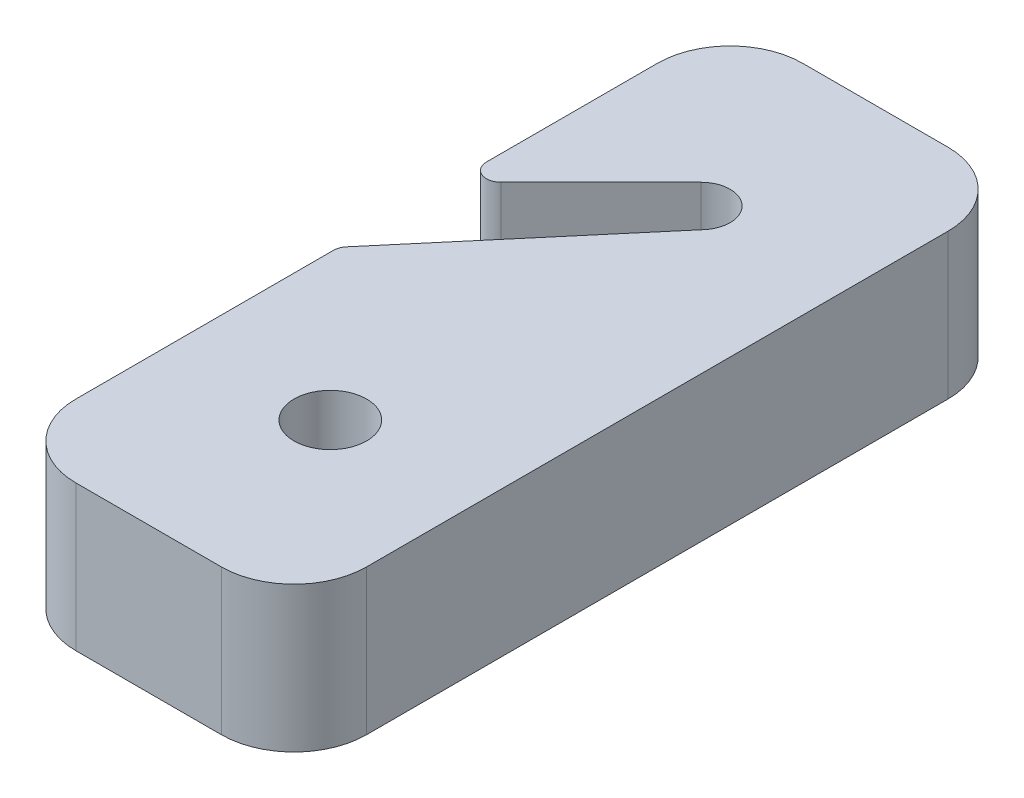
ISO-10303-21;
HEADER;
FILE_DESCRIPTION(('STEP AP214'),'2;1');
FILE_NAME('part.step','',(''),(''),'','','');
FILE_SCHEMA(('AUTOMOTIVE_DESIGN { 1 0 10303 214 1 1 1 1 }'));
ENDSEC;
DATA;
#1=APPLICATION_CONTEXT('core data for automotive mechanical design processes');
#2=APPLICATION_PROTOCOL_DEFINITION('international standard','automotive_design',2000,#1);
#3=PRODUCT_CONTEXT('',#1,'mechanical');
#4=PRODUCT('Part','Part','',(#3));
#5=PRODUCT_RELATED_PRODUCT_CATEGORY('part','',(#4));
#6=PRODUCT_DEFINITION_FORMATION('','',#4);
#7=PRODUCT_DEFINITION_CONTEXT('part definition',#1,'design');
#8=PRODUCT_DEFINITION('design','',#6,#7);
#9=PRODUCT_DEFINITION_SHAPE('','',#8);
#10=(LENGTH_UNIT() NAMED_UNIT(*) SI_UNIT(.MILLI.,.METRE.));
#11=(NAMED_UNIT(*) PLANE_ANGLE_UNIT() SI_UNIT($,.RADIAN.));
#12=(NAMED_UNIT(*) SI_UNIT($,.STERADIAN.) SOLID_ANGLE_UNIT());
#13=UNCERTAINTY_MEASURE_WITH_UNIT(LENGTH_MEASURE(1.E-05),#10,'distance_accuracy_value','');
#14=(GEOMETRIC_REPRESENTATION_CONTEXT(3) GLOBAL_UNCERTAINTY_ASSIGNED_CONTEXT((#13)) GLOBAL_UNIT_ASSIGNED_CONTEXT((#10,
#11,#12)) REPRESENTATION_CONTEXT('',''));
#15=CARTESIAN_POINT('',(0.,0.,0.));
#16=DIRECTION('',(0.,0.,1.));
#17=DIRECTION('',(1.,0.,0.));
#18=AXIS2_PLACEMENT_3D('',#15,#16,#17);
#19=CARTESIAN_POINT('',(-6.35,6.35,0.));
#20=DIRECTION('',(-1.,0.,0.));
#21=DIRECTION('',(0.,0.,1.));
#22=AXIS2_PLACEMENT_3D('',#19,#20,#21);
#23=PLANE('',#22);
#24=DIRECTION('',(0.,0.,-1.));
#25=VECTOR('',#24,1.);
#26=CARTESIAN_POINT('',(-6.35,0.,0.));
#27=LINE('',#26,#25);
#28=CARTESIAN_POINT('',(-6.35,0.,-5.2340768363207));
#29=VERTEX_POINT('',#28);
#30=CARTESIAN_POINT('',(-6.35,0.,-12.7));
#31=VERTEX_POINT('',#30);
#32=EDGE_CURVE('E216',#29,#31,#27,.T.);
#33=ORIENTED_EDGE('',*,*,#32,.F.);
#34=DIRECTION('',(0.,-1.,0.));
#35=VECTOR('',#34,1.);
#36=CARTESIAN_POINT('',(-6.35,6.35,-5.2340768363207));
#37=LINE('',#36,#35);
#38=CARTESIAN_POINT('',(-6.35,6.35,-5.2340768363207));
#39=VERTEX_POINT('',#38);
#40=EDGE_CURVE('E12',#29,#39,#37,.F.);
#41=ORIENTED_EDGE('',*,*,#40,.T.);
#42=DIRECTION('',(0.,0.,-1.));
#43=VECTOR('',#42,1.);
#44=CARTESIAN_POINT('',(-6.35,6.35,0.));
#45=LINE('',#44,#43);
#46=CARTESIAN_POINT('',(-6.35,6.35,-12.7));
#47=VERTEX_POINT('',#46);
#48=EDGE_CURVE('E212',#39,#47,#45,.T.);
#49=ORIENTED_EDGE('',*,*,#48,.T.);
#50=DIRECTION('',(0.,-1.,0.));
#51=VECTOR('',#50,1.);
#52=CARTESIAN_POINT('',(-6.35,0.,-12.7));
#53=LINE('',#52,#51);
#54=EDGE_CURVE('E211',#47,#31,#53,.T.);
#55=ORIENTED_EDGE('',*,*,#54,.T.);
#56=EDGE_LOOP('',(#33,#41,#49,#55));
#57=FACE_BOUND('',#56,.T.);
#58=ADVANCED_FACE('F74',(#57),#23,.T.);
#59=CARTESIAN_POINT('',(-6.35,6.35,12.7));
#60=VERTEX_POINT('',#59);
#61=CARTESIAN_POINT('',(-6.35,6.35,1.44619663214178));
#62=VERTEX_POINT('',#61);
#63=EDGE_CURVE('E208',#60,#62,#45,.T.);
#64=ORIENTED_EDGE('',*,*,#63,.T.);
#65=DIRECTION('',(0.,-1.,0.));
#66=VECTOR('',#65,1.);
#67=CARTESIAN_POINT('',(-6.35,0.,1.44619663214178));
#68=LINE('',#67,#66);
#69=CARTESIAN_POINT('',(-6.35,0.,1.44619663214178));
#70=VERTEX_POINT('',#69);
#71=EDGE_CURVE('E276',#62,#70,#68,.T.);
#72=ORIENTED_EDGE('',*,*,#71,.T.);
#73=CARTESIAN_POINT('',(-6.35,0.,12.7));
#74=VERTEX_POINT('',#73);
#75=EDGE_CURVE('E213',#74,#70,#27,.T.);
#76=ORIENTED_EDGE('',*,*,#75,.F.);
#77=DIRECTION('',(0.,-1.,0.));
#78=VECTOR('',#77,1.);
#79=CARTESIAN_POINT('',(-6.35,6.35,12.7));
#80=LINE('',#79,#78);
#81=EDGE_CURVE('E274',#74,#60,#80,.F.);
#82=ORIENTED_EDGE('',*,*,#81,.T.);
#83=EDGE_LOOP('',(#64,#72,#76,#82));
#84=FACE_BOUND('',#83,.T.);
#85=ADVANCED_FACE('F301',(#84),#23,.T.);
#86=CARTESIAN_POINT('',(0.,0.,0.));
#87=DIRECTION('',(0.,1.,0.));
#88=DIRECTION('',(0.,0.,1.));
#89=AXIS2_PLACEMENT_3D('',#86,#87,#88);
#90=PLANE('',#89);
#91=ORIENTED_EDGE('',*,*,#75,.T.);
#92=CARTESIAN_POINT('',(-5.715,0.,1.44619663214178));
#93=DIRECTION('',(0.,1.,0.));
#94=DIRECTION('',(0.,0.,1.));
#95=AXIS2_PLACEMENT_3D('',#92,#93,#94);
#96=CIRCLE('',#95,0.635);
#97=CARTESIAN_POINT('',(-6.19970076161779,0.,1.03596478100498));
#98=VERTEX_POINT('',#97);
#99=EDGE_CURVE('E281',#70,#98,#96,.F.);
#100=ORIENTED_EDGE('',*,*,#99,.T.);
#101=DIRECTION('',(-0.646034411239067,0.,0.763308286012272));
#102=VECTOR('',#101,1.);
#103=CARTESIAN_POINT('',(-3.10133230182983,0.,-2.62484689919522));
#104=LINE('',#103,#102);
#105=CARTESIAN_POINT('',(0.969401523235585,0.,-7.43453629772638));
#106=VERTEX_POINT('',#105);
#107=EDGE_CURVE('E202',#106,#98,#104,.T.);
#108=ORIENTED_EDGE('',*,*,#107,.F.);
#109=CARTESIAN_POINT('',(0.,0.,-8.255));
#110=DIRECTION('',(0.,1.,0.));
#111=DIRECTION('',(0.,0.,1.));
#112=AXIS2_PLACEMENT_3D('',#109,#110,#111);
#113=CIRCLE('',#112,1.27);
#114=CARTESIAN_POINT('',(-0.898025612106921,0.,-9.15302561210691));
#115=VERTEX_POINT('',#114);
#116=EDGE_CURVE('E181',#106,#115,#113,.T.);
#117=ORIENTED_EDGE('',*,*,#116,.T.);
#118=DIRECTION('',(-0.707106781186544,0.,0.707106781186551));
#119=VECTOR('',#118,1.);
#120=CARTESIAN_POINT('',(-5.02552561210692,0.,-5.02552561210686));
#121=LINE('',#120,#119);
#122=CARTESIAN_POINT('',(-5.26598719394654,0.,-4.78506403026724));
#123=VERTEX_POINT('',#122);
#124=EDGE_CURVE('E194',#115,#123,#121,.T.);
#125=ORIENTED_EDGE('',*,*,#124,.T.);
#126=CARTESIAN_POINT('',(-5.715,0.,-5.2340768363207));
#127=DIRECTION('',(0.,1.,0.));
#128=DIRECTION('',(0.,0.,1.));
#129=AXIS2_PLACEMENT_3D('',#126,#127,#128);
#130=CIRCLE('',#129,0.635);
#131=EDGE_CURVE('E279',#123,#29,#130,.F.);
#132=ORIENTED_EDGE('',*,*,#131,.T.);
#133=ORIENTED_EDGE('',*,*,#32,.T.);
#134=CARTESIAN_POINT('',(-3.175,0.,-12.7));
#135=DIRECTION('',(0.,1.,0.));
#136=DIRECTION('',(0.,0.,1.));
#137=AXIS2_PLACEMENT_3D('',#134,#135,#136);
#138=CIRCLE('',#137,3.175);
#139=CARTESIAN_POINT('',(-3.175,0.,-15.875));
#140=VERTEX_POINT('',#139);
#141=EDGE_CURVE('E248',#31,#140,#138,.F.);
#142=ORIENTED_EDGE('',*,*,#141,.T.);
#143=DIRECTION('',(-1.,0.,0.));
#144=VECTOR('',#143,1.);
#145=CARTESIAN_POINT('',(6.35,0.,-15.875));
#146=LINE('',#145,#144);
#147=CARTESIAN_POINT('',(3.175,0.,-15.875));
#148=VERTEX_POINT('',#147);
#149=EDGE_CURVE('E235',#148,#140,#146,.T.);
#150=ORIENTED_EDGE('',*,*,#149,.F.);
#151=CARTESIAN_POINT('',(3.175,0.,-12.7));
#152=DIRECTION('',(0.,1.,0.));
#153=DIRECTION('',(0.,0.,1.));
#154=AXIS2_PLACEMENT_3D('',#151,#152,#153);
#155=CIRCLE('',#154,3.175);
#156=CARTESIAN_POINT('',(6.35,0.,-12.7));
#157=VERTEX_POINT('',#156);
#158=EDGE_CURVE('E246',#148,#157,#155,.F.);
#159=ORIENTED_EDGE('',*,*,#158,.T.);
#160=DIRECTION('',(0.,0.,-1.));
#161=VECTOR('',#160,1.);
#162=CARTESIAN_POINT('',(6.35,0.,15.875));
#163=LINE('',#162,#161);
#164=CARTESIAN_POINT('',(6.35,0.,12.7));
#165=VERTEX_POINT('',#164);
#166=EDGE_CURVE('E220',#165,#157,#163,.T.);
#167=ORIENTED_EDGE('',*,*,#166,.F.);
#168=CARTESIAN_POINT('',(3.175,0.,12.7));
#169=DIRECTION('',(0.,1.,0.));
#170=DIRECTION('',(0.,0.,1.));
#171=AXIS2_PLACEMENT_3D('',#168,#169,#170);
#172=CIRCLE('',#171,3.175);
#173=CARTESIAN_POINT('',(3.175,0.,15.875));
#174=VERTEX_POINT('',#173);
#175=EDGE_CURVE('E244',#165,#174,#172,.F.);
#176=ORIENTED_EDGE('',*,*,#175,.T.);
#177=DIRECTION('',(-1.,0.,0.));
#178=VECTOR('',#177,1.);
#179=CARTESIAN_POINT('',(6.35,0.,15.875));
#180=LINE('',#179,#178);
#181=CARTESIAN_POINT('',(-3.175,0.,15.875));
#182=VERTEX_POINT('',#181);
#183=EDGE_CURVE('E227',#174,#182,#180,.T.);
#184=ORIENTED_EDGE('',*,*,#183,.T.);
#185=CARTESIAN_POINT('',(-3.175,0.,12.7));
#186=DIRECTION('',(0.,1.,0.));
#187=DIRECTION('',(0.,0.,1.));
#188=AXIS2_PLACEMENT_3D('',#185,#186,#187);
#189=CIRCLE('',#188,3.175);
#190=EDGE_CURVE('E242',#182,#74,#189,.F.);
#191=ORIENTED_EDGE('',*,*,#190,.T.);
#192=EDGE_LOOP('',(#91,#100,#108,#117,#125,#132,#133,#142,#150,#159,#167,#176,#184,#191));
#193=FACE_BOUND('',#192,.T.);
#194=CARTESIAN_POINT('',(0.,0.,7.93750000000001));
#195=DIRECTION('',(0.,1.,0.));
#196=DIRECTION('',(0.,0.,1.));
#197=AXIS2_PLACEMENT_3D('',#194,#195,#196);
#198=CIRCLE('',#197,1.5875);
#199=CARTESIAN_POINT('',(0.,0.,9.52500000000001));
#200=VERTEX_POINT('',#199);
#201=EDGE_CURVE('E185',#200,#200,#198,.T.);
#202=ORIENTED_EDGE('',*,*,#201,.T.);
#203=EDGE_LOOP('',(#202));
#204=FACE_BOUND('',#203,.T.);
#205=ADVANCED_FACE('F293',(#193,#204),#90,.F.);
#206=CARTESIAN_POINT('',(0.,6.35,0.));
#207=DIRECTION('',(0.,1.,0.));
#208=DIRECTION('',(0.,0.,1.));
#209=AXIS2_PLACEMENT_3D('',#206,#207,#208);
#210=PLANE('',#209);
#211=DIRECTION('',(-0.646034411239067,0.,0.763308286012272));
#212=VECTOR('',#211,1.);
#213=CARTESIAN_POINT('',(-3.10133230182983,6.35,-2.62484689919522));
#214=LINE('',#213,#212);
#215=CARTESIAN_POINT('',(0.969401523235585,6.35,-7.43453629772638));
#216=VERTEX_POINT('',#215);
#217=CARTESIAN_POINT('',(-6.19970076161779,6.35,1.03596478100498));
#218=VERTEX_POINT('',#217);
#219=EDGE_CURVE('E189',#216,#218,#214,.T.);
#220=ORIENTED_EDGE('',*,*,#219,.T.);
#221=CARTESIAN_POINT('',(-5.715,6.35,1.44619663214178));
#222=DIRECTION('',(0.,1.,0.));
#223=DIRECTION('',(0.,0.,1.));
#224=AXIS2_PLACEMENT_3D('',#221,#222,#223);
#225=CIRCLE('',#224,0.635);
#226=EDGE_CURVE('E285',#218,#62,#225,.T.);
#227=ORIENTED_EDGE('',*,*,#226,.T.);
#228=ORIENTED_EDGE('',*,*,#63,.F.);
#229=CARTESIAN_POINT('',(-3.175,6.35,12.7));
#230=DIRECTION('',(0.,1.,0.));
#231=DIRECTION('',(0.,0.,1.));
#232=AXIS2_PLACEMENT_3D('',#229,#230,#231);
#233=CIRCLE('',#232,3.175);
#234=CARTESIAN_POINT('',(-3.175,6.35,15.875));
#235=VERTEX_POINT('',#234);
#236=EDGE_CURVE('E255',#60,#235,#233,.T.);
#237=ORIENTED_EDGE('',*,*,#236,.T.);
#238=DIRECTION('',(-1.,0.,0.));
#239=VECTOR('',#238,1.);
#240=CARTESIAN_POINT('',(6.35,6.35,15.875));
#241=LINE('',#240,#239);
#242=CARTESIAN_POINT('',(3.175,6.35,15.875));
#243=VERTEX_POINT('',#242);
#244=EDGE_CURVE('E230',#243,#235,#241,.T.);
#245=ORIENTED_EDGE('',*,*,#244,.F.);
#246=CARTESIAN_POINT('',(3.175,6.35,12.7));
#247=DIRECTION('',(0.,1.,0.));
#248=DIRECTION('',(0.,0.,1.));
#249=AXIS2_PLACEMENT_3D('',#246,#247,#248);
#250=CIRCLE('',#249,3.175);
#251=CARTESIAN_POINT('',(6.35,6.35,12.7));
#252=VERTEX_POINT('',#251);
#253=EDGE_CURVE('E257',#243,#252,#250,.T.);
#254=ORIENTED_EDGE('',*,*,#253,.T.);
#255=DIRECTION('',(0.,0.,-1.));
#256=VECTOR('',#255,1.);
#257=CARTESIAN_POINT('',(6.35,6.35,15.875));
#258=LINE('',#257,#256);
#259=CARTESIAN_POINT('',(6.35,6.35,-12.7));
#260=VERTEX_POINT('',#259);
#261=EDGE_CURVE('E223',#252,#260,#258,.T.);
#262=ORIENTED_EDGE('',*,*,#261,.T.);
#263=CARTESIAN_POINT('',(3.175,6.35,-12.7));
#264=DIRECTION('',(0.,1.,0.));
#265=DIRECTION('',(0.,0.,1.));
#266=AXIS2_PLACEMENT_3D('',#263,#264,#265);
#267=CIRCLE('',#266,3.175);
#268=CARTESIAN_POINT('',(3.175,6.35,-15.875));
#269=VERTEX_POINT('',#268);
#270=EDGE_CURVE('E259',#260,#269,#267,.T.);
#271=ORIENTED_EDGE('',*,*,#270,.T.);
#272=DIRECTION('',(-1.,0.,0.));
#273=VECTOR('',#272,1.);
#274=CARTESIAN_POINT('',(6.35,6.35,-15.875));
#275=LINE('',#274,#273);
#276=CARTESIAN_POINT('',(-3.175,6.35,-15.875));
#277=VERTEX_POINT('',#276);
#278=EDGE_CURVE('E226',#269,#277,#275,.T.);
#279=ORIENTED_EDGE('',*,*,#278,.T.);
#280=CARTESIAN_POINT('',(-3.175,6.35,-12.7));
#281=DIRECTION('',(0.,1.,0.));
#282=DIRECTION('',(0.,0.,1.));
#283=AXIS2_PLACEMENT_3D('',#280,#281,#282);
#284=CIRCLE('',#283,3.175);
#285=EDGE_CURVE('E261',#277,#47,#284,.T.);
#286=ORIENTED_EDGE('',*,*,#285,.T.);
#287=ORIENTED_EDGE('',*,*,#48,.F.);
#288=CARTESIAN_POINT('',(-5.715,6.35,-5.2340768363207));
#289=DIRECTION('',(0.,1.,0.));
#290=DIRECTION('',(0.,0.,1.));
#291=AXIS2_PLACEMENT_3D('',#288,#289,#290);
#292=CIRCLE('',#291,0.635);
#293=CARTESIAN_POINT('',(-5.26598719394654,6.35,-4.78506403026724));
#294=VERTEX_POINT('',#293);
#295=EDGE_CURVE('E89',#39,#294,#292,.T.);
#296=ORIENTED_EDGE('',*,*,#295,.T.);
#297=DIRECTION('',(-0.707106781186544,0.,0.707106781186551));
#298=VECTOR('',#297,1.);
#299=CARTESIAN_POINT('',(-5.02552561210692,6.35,-5.02552561210686));
#300=LINE('',#299,#298);
#301=CARTESIAN_POINT('',(-0.898025612106921,6.35,-9.15302561210691));
#302=VERTEX_POINT('',#301);
#303=EDGE_CURVE('E198',#302,#294,#300,.T.);
#304=ORIENTED_EDGE('',*,*,#303,.F.);
#305=CARTESIAN_POINT('',(0.,6.35,-8.255));
#306=DIRECTION('',(0.,1.,0.));
#307=DIRECTION('',(0.,0.,1.));
#308=AXIS2_PLACEMENT_3D('',#305,#306,#307);
#309=CIRCLE('',#308,1.27);
#310=EDGE_CURVE('E179',#216,#302,#309,.T.);
#311=ORIENTED_EDGE('',*,*,#310,.F.);
#312=EDGE_LOOP('',(#220,#227,#228,#237,#245,#254,#262,#271,#279,#286,#287,#296,#304,#311));
#313=FACE_BOUND('',#312,.T.);
#314=CARTESIAN_POINT('',(0.,6.35,7.93750000000001));
#315=DIRECTION('',(0.,1.,0.));
#316=DIRECTION('',(0.,0.,1.));
#317=AXIS2_PLACEMENT_3D('',#314,#315,#316);
#318=CIRCLE('',#317,1.5875);
#319=CARTESIAN_POINT('',(0.,6.35,9.52500000000001));
#320=VERTEX_POINT('',#319);
#321=EDGE_CURVE('E217',#320,#320,#318,.T.);
#322=ORIENTED_EDGE('',*,*,#321,.F.);
#323=EDGE_LOOP('',(#322));
#324=FACE_BOUND('',#323,.T.);
#325=ADVANCED_FACE('F196',(#313,#324),#210,.T.);
#326=CARTESIAN_POINT('',(0.,6.35,7.93750000000001));
#327=DIRECTION('',(0.,-1.,0.));
#328=DIRECTION('',(0.,0.,-1.));
#329=AXIS2_PLACEMENT_3D('',#326,#327,#328);
#330=CYLINDRICAL_SURFACE('',#329,1.5875);
#331=ORIENTED_EDGE('',*,*,#321,.T.);
#332=EDGE_LOOP('',(#331));
#333=FACE_BOUND('',#332,.T.);
#334=ORIENTED_EDGE('',*,*,#201,.F.);
#335=EDGE_LOOP('',(#334));
#336=FACE_BOUND('',#335,.T.);
#337=ADVANCED_FACE('F350',(#333,#336),#330,.F.);
#338=CARTESIAN_POINT('',(6.35,6.35,15.875));
#339=DIRECTION('',(0.,0.,1.));
#340=DIRECTION('',(1.,0.,0.));
#341=AXIS2_PLACEMENT_3D('',#338,#339,#340);
#342=PLANE('',#341);
#343=ORIENTED_EDGE('',*,*,#183,.F.);
#344=DIRECTION('',(0.,-1.,0.));
#345=VECTOR('',#344,1.);
#346=CARTESIAN_POINT('',(3.175,6.35,15.875));
#347=LINE('',#346,#345);
#348=EDGE_CURVE('E272',#174,#243,#347,.F.);
#349=ORIENTED_EDGE('',*,*,#348,.T.);
#350=ORIENTED_EDGE('',*,*,#244,.T.);
#351=DIRECTION('',(0.,-1.,0.));
#352=VECTOR('',#351,1.);
#353=CARTESIAN_POINT('',(-3.175,6.35,15.875));
#354=LINE('',#353,#352);
#355=EDGE_CURVE('E269',#235,#182,#354,.T.);
#356=ORIENTED_EDGE('',*,*,#355,.T.);
#357=EDGE_LOOP('',(#343,#349,#350,#356));
#358=FACE_BOUND('',#357,.T.);
#359=ADVANCED_FACE('F311',(#358),#342,.T.);
#360=CARTESIAN_POINT('',(6.35,6.35,15.875));
#361=DIRECTION('',(-1.,0.,0.));
#362=DIRECTION('',(0.,0.,1.));
#363=AXIS2_PLACEMENT_3D('',#360,#361,#362);
#364=PLANE('',#363);
#365=ORIENTED_EDGE('',*,*,#166,.T.);
#366=DIRECTION('',(0.,-1.,0.));
#367=VECTOR('',#366,1.);
#368=CARTESIAN_POINT('',(6.35,6.35,-12.7));
#369=LINE('',#368,#367);
#370=EDGE_CURVE('E267',#157,#260,#369,.F.);
#371=ORIENTED_EDGE('',*,*,#370,.T.);
#372=ORIENTED_EDGE('',*,*,#261,.F.);
#373=DIRECTION('',(0.,-1.,0.));
#374=VECTOR('',#373,1.);
#375=CARTESIAN_POINT('',(6.35,0.,12.7));
#376=LINE('',#375,#374);
#377=EDGE_CURVE('E264',#252,#165,#376,.T.);
#378=ORIENTED_EDGE('',*,*,#377,.T.);
#379=EDGE_LOOP('',(#365,#371,#372,#378));
#380=FACE_BOUND('',#379,.T.);
#381=ADVANCED_FACE('F319',(#380),#364,.F.);
#382=CARTESIAN_POINT('',(6.35,6.35,-15.875));
#383=DIRECTION('',(0.,0.,1.));
#384=DIRECTION('',(1.,0.,0.));
#385=AXIS2_PLACEMENT_3D('',#382,#383,#384);
#386=PLANE('',#385);
#387=ORIENTED_EDGE('',*,*,#149,.T.);
#388=DIRECTION('',(0.,-1.,0.));
#389=VECTOR('',#388,1.);
#390=CARTESIAN_POINT('',(-3.175,6.35,-15.875));
#391=LINE('',#390,#389);
#392=EDGE_CURVE('E253',#140,#277,#391,.F.);
#393=ORIENTED_EDGE('',*,*,#392,.T.);
#394=ORIENTED_EDGE('',*,*,#278,.F.);
#395=DIRECTION('',(0.,-1.,0.));
#396=VECTOR('',#395,1.);
#397=CARTESIAN_POINT('',(3.175,6.35,-15.875));
#398=LINE('',#397,#396);
#399=EDGE_CURVE('E250',#269,#148,#398,.T.);
#400=ORIENTED_EDGE('',*,*,#399,.T.);
#401=EDGE_LOOP('',(#387,#393,#394,#400));
#402=FACE_BOUND('',#401,.T.);
#403=ADVANCED_FACE('F328',(#402),#386,.F.);
#404=CARTESIAN_POINT('',(-3.10133230182983,6.35,-2.62484689919522));
#405=DIRECTION('',(0.763308286012272,0.,0.646034411239067));
#406=DIRECTION('',(0.646034411239067,0.,-0.763308286012272));
#407=AXIS2_PLACEMENT_3D('',#404,#405,#406);
#408=PLANE('',#407);
#409=ORIENTED_EDGE('',*,*,#107,.T.);
#410=DIRECTION('',(0.,-1.,0.));
#411=VECTOR('',#410,1.);
#412=CARTESIAN_POINT('',(-6.19970076161779,6.35,1.03596478100498));
#413=LINE('',#412,#411);
#414=EDGE_CURVE('E192',#98,#218,#413,.F.);
#415=ORIENTED_EDGE('',*,*,#414,.T.);
#416=ORIENTED_EDGE('',*,*,#219,.F.);
#417=DIRECTION('',(0.,-1.,0.));
#418=VECTOR('',#417,1.);
#419=CARTESIAN_POINT('',(0.969401523235585,6.35,-7.43453629772638));
#420=LINE('',#419,#418);
#421=EDGE_CURVE('E175',#216,#106,#420,.T.);
#422=ORIENTED_EDGE('',*,*,#421,.T.);
#423=EDGE_LOOP('',(#409,#415,#416,#422));
#424=FACE_BOUND('',#423,.T.);
#425=ADVANCED_FACE('F190',(#424),#408,.F.);
#426=CARTESIAN_POINT('',(0.,6.35,-8.255));
#427=DIRECTION('',(0.,-1.,0.));
#428=DIRECTION('',(0.,0.,-1.));
#429=AXIS2_PLACEMENT_3D('',#426,#427,#428);
#430=CYLINDRICAL_SURFACE('',#429,1.27);
#431=ORIENTED_EDGE('',*,*,#116,.F.);
#432=ORIENTED_EDGE('',*,*,#421,.F.);
#433=ORIENTED_EDGE('',*,*,#310,.T.);
#434=DIRECTION('',(0.,-1.,0.));
#435=VECTOR('',#434,1.);
#436=CARTESIAN_POINT('',(-0.898025612106921,6.35,-9.15302561210691));
#437=LINE('',#436,#435);
#438=EDGE_CURVE('E186',#302,#115,#437,.T.);
#439=ORIENTED_EDGE('',*,*,#438,.T.);
#440=EDGE_LOOP('',(#431,#432,#433,#439));
#441=FACE_BOUND('',#440,.T.);
#442=ADVANCED_FACE('F177',(#441),#430,.F.);
#443=CARTESIAN_POINT('',(-5.02552561210692,6.35,-5.02552561210686));
#444=DIRECTION('',(0.707106781186551,0.,0.707106781186544));
#445=DIRECTION('',(0.707106781186544,0.,-0.707106781186551));
#446=AXIS2_PLACEMENT_3D('',#443,#444,#445);
#447=PLANE('',#446);
#448=ORIENTED_EDGE('',*,*,#303,.T.);
#449=DIRECTION('',(0.,-1.,0.));
#450=VECTOR('',#449,1.);
#451=CARTESIAN_POINT('',(-5.26598719394654,6.35,-4.78506403026724));
#452=LINE('',#451,#450);
#453=EDGE_CURVE('E82',#294,#123,#452,.T.);
#454=ORIENTED_EDGE('',*,*,#453,.T.);
#455=ORIENTED_EDGE('',*,*,#124,.F.);
#456=ORIENTED_EDGE('',*,*,#438,.F.);
#457=EDGE_LOOP('',(#448,#454,#455,#456));
#458=FACE_BOUND('',#457,.T.);
#459=ADVANCED_FACE('F290',(#458),#447,.T.);
#460=CARTESIAN_POINT('',(-3.175,6.35,-12.7));
#461=DIRECTION('',(0.,1.,0.));
#462=DIRECTION('',(0.,0.,1.));
#463=AXIS2_PLACEMENT_3D('',#460,#461,#462);
#464=CYLINDRICAL_SURFACE('',#463,3.175);
#465=ORIENTED_EDGE('',*,*,#285,.F.);
#466=ORIENTED_EDGE('',*,*,#392,.F.);
#467=ORIENTED_EDGE('',*,*,#141,.F.);
#468=ORIENTED_EDGE('',*,*,#54,.F.);
#469=EDGE_LOOP('',(#465,#466,#467,#468));
#470=FACE_BOUND('',#469,.T.);
#471=ADVANCED_FACE('F333',(#470),#464,.T.);
#472=CARTESIAN_POINT('',(3.175,6.35,-12.7));
#473=DIRECTION('',(0.,-1.,0.));
#474=DIRECTION('',(0.,0.,-1.));
#475=AXIS2_PLACEMENT_3D('',#472,#473,#474);
#476=CYLINDRICAL_SURFACE('',#475,3.175);
#477=ORIENTED_EDGE('',*,*,#270,.F.);
#478=ORIENTED_EDGE('',*,*,#370,.F.);
#479=ORIENTED_EDGE('',*,*,#158,.F.);
#480=ORIENTED_EDGE('',*,*,#399,.F.);
#481=EDGE_LOOP('',(#477,#478,#479,#480));
#482=FACE_BOUND('',#481,.T.);
#483=ADVANCED_FACE('F323',(#482),#476,.T.);
#484=CARTESIAN_POINT('',(3.175,6.35,12.7));
#485=DIRECTION('',(0.,1.,0.));
#486=DIRECTION('',(0.,0.,1.));
#487=AXIS2_PLACEMENT_3D('',#484,#485,#486);
#488=CYLINDRICAL_SURFACE('',#487,3.175);
#489=ORIENTED_EDGE('',*,*,#253,.F.);
#490=ORIENTED_EDGE('',*,*,#348,.F.);
#491=ORIENTED_EDGE('',*,*,#175,.F.);
#492=ORIENTED_EDGE('',*,*,#377,.F.);
#493=EDGE_LOOP('',(#489,#490,#491,#492));
#494=FACE_BOUND('',#493,.T.);
#495=ADVANCED_FACE('F314',(#494),#488,.T.);
#496=CARTESIAN_POINT('',(-3.175,6.35,12.7));
#497=DIRECTION('',(0.,-1.,0.));
#498=DIRECTION('',(0.,0.,-1.));
#499=AXIS2_PLACEMENT_3D('',#496,#497,#498);
#500=CYLINDRICAL_SURFACE('',#499,3.175);
#501=ORIENTED_EDGE('',*,*,#236,.F.);
#502=ORIENTED_EDGE('',*,*,#81,.F.);
#503=ORIENTED_EDGE('',*,*,#190,.F.);
#504=ORIENTED_EDGE('',*,*,#355,.F.);
#505=EDGE_LOOP('',(#501,#502,#503,#504));
#506=FACE_BOUND('',#505,.T.);
#507=ADVANCED_FACE('F305',(#506),#500,.T.);
#508=CARTESIAN_POINT('',(-5.715,6.35,1.44619663214178));
#509=DIRECTION('',(0.,1.,0.));
#510=DIRECTION('',(0.,0.,1.));
#511=AXIS2_PLACEMENT_3D('',#508,#509,#510);
#512=CYLINDRICAL_SURFACE('',#511,0.635);
#513=ORIENTED_EDGE('',*,*,#226,.F.);
#514=ORIENTED_EDGE('',*,*,#414,.F.);
#515=ORIENTED_EDGE('',*,*,#99,.F.);
#516=ORIENTED_EDGE('',*,*,#71,.F.);
#517=EDGE_LOOP('',(#513,#514,#515,#516));
#518=FACE_BOUND('',#517,.T.);
#519=ADVANCED_FACE('F296',(#518),#512,.T.);
#520=CARTESIAN_POINT('',(-5.715,6.35,-5.2340768363207));
#521=DIRECTION('',(0.,-1.,0.));
#522=DIRECTION('',(0.,0.,-1.));
#523=AXIS2_PLACEMENT_3D('',#520,#521,#522);
#524=CYLINDRICAL_SURFACE('',#523,0.635);
#525=ORIENTED_EDGE('',*,*,#295,.F.);
#526=ORIENTED_EDGE('',*,*,#40,.F.);
#527=ORIENTED_EDGE('',*,*,#131,.F.);
#528=ORIENTED_EDGE('',*,*,#453,.F.);
#529=EDGE_LOOP('',(#525,#526,#527,#528));
#530=FACE_BOUND('',#529,.T.);
#531=ADVANCED_FACE('F76',(#530),#524,.T.);
#532=CLOSED_SHELL('',(#58,#85,#205,#325,#337,#359,#381,#403,#425,#442,#459,#471,#483,#495,#507,
#519,#531));
#533=MANIFOLD_SOLID_BREP('B2',#532);
#534=ADVANCED_BREP_SHAPE_REPRESENTATION('',(#18,#533),#14);
#535=SHAPE_DEFINITION_REPRESENTATION(#9,#534);
ENDSEC;
END-ISO-10303-21;
